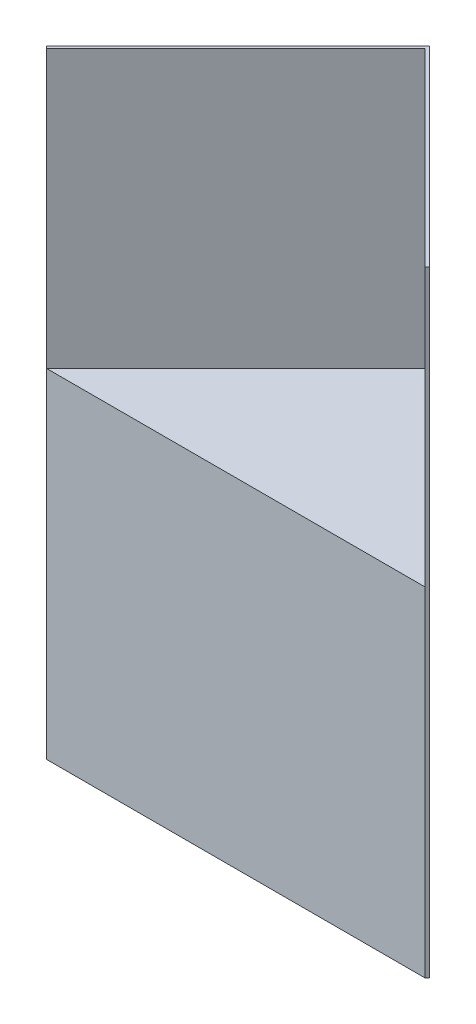
ISO-10303-21;
HEADER;
FILE_DESCRIPTION(('STEP AP214'),'2;1');
FILE_NAME('part.step','',(''),(''),'','','');
FILE_SCHEMA(('AUTOMOTIVE_DESIGN { 1 0 10303 214 1 1 1 1 }'));
ENDSEC;
DATA;
#1=APPLICATION_CONTEXT('core data for automotive mechanical design processes');
#2=APPLICATION_PROTOCOL_DEFINITION('international standard','automotive_design',2000,#1);
#3=PRODUCT_CONTEXT('',#1,'mechanical');
#4=PRODUCT('Part','Part','',(#3));
#5=PRODUCT_RELATED_PRODUCT_CATEGORY('part','',(#4));
#6=PRODUCT_DEFINITION_FORMATION('','',#4);
#7=PRODUCT_DEFINITION_CONTEXT('part definition',#1,'design');
#8=PRODUCT_DEFINITION('design','',#6,#7);
#9=PRODUCT_DEFINITION_SHAPE('','',#8);
#10=(LENGTH_UNIT() NAMED_UNIT(*) SI_UNIT(.MILLI.,.METRE.));
#11=(NAMED_UNIT(*) PLANE_ANGLE_UNIT() SI_UNIT($,.RADIAN.));
#12=(NAMED_UNIT(*) SI_UNIT($,.STERADIAN.) SOLID_ANGLE_UNIT());
#13=UNCERTAINTY_MEASURE_WITH_UNIT(LENGTH_MEASURE(1.E-05),#10,'distance_accuracy_value','');
#14=(GEOMETRIC_REPRESENTATION_CONTEXT(3) GLOBAL_UNCERTAINTY_ASSIGNED_CONTEXT((#13)) GLOBAL_UNIT_ASSIGNED_CONTEXT((#10,
#11,#12)) REPRESENTATION_CONTEXT('',''));
#15=CARTESIAN_POINT('',(0.,0.,0.));
#16=DIRECTION('',(0.,0.,1.));
#17=DIRECTION('',(1.,0.,0.));
#18=AXIS2_PLACEMENT_3D('',#15,#16,#17);
#19=CARTESIAN_POINT('',(-781.05,1397.,781.05));
#20=DIRECTION('',(0.,0.,-1.));
#21=DIRECTION('',(-1.,0.,0.));
#22=AXIS2_PLACEMENT_3D('',#19,#20,#21);
#23=PLANE('',#22);
#24=DIRECTION('',(1.,0.,0.));
#25=VECTOR('',#24,1.);
#26=CARTESIAN_POINT('',(-781.05,0.,781.05));
#27=LINE('',#26,#25);
#28=CARTESIAN_POINT('',(-781.05,0.,781.05));
#29=VERTEX_POINT('',#28);
#30=CARTESIAN_POINT('',(781.05,0.,781.05));
#31=VERTEX_POINT('',#30);
#32=EDGE_CURVE('E120',#29,#31,#27,.T.);
#33=ORIENTED_EDGE('',*,*,#32,.T.);
#34=DIRECTION('',(0.,-1.,0.));
#35=VECTOR('',#34,1.);
#36=CARTESIAN_POINT('',(781.05,1397.,781.05));
#37=LINE('',#36,#35);
#38=CARTESIAN_POINT('',(781.05,1397.,781.05));
#39=VERTEX_POINT('',#38);
#40=EDGE_CURVE('E49',#39,#31,#37,.T.);
#41=ORIENTED_EDGE('',*,*,#40,.F.);
#42=DIRECTION('',(1.,0.,0.));
#43=VECTOR('',#42,1.);
#44=CARTESIAN_POINT('',(-781.05,1397.,781.05));
#45=LINE('',#44,#43);
#46=CARTESIAN_POINT('',(-781.05,1397.,781.05));
#47=VERTEX_POINT('',#46);
#48=EDGE_CURVE('E56',#47,#39,#45,.T.);
#49=ORIENTED_EDGE('',*,*,#48,.F.);
#50=DIRECTION('',(0.,-1.,0.));
#51=VECTOR('',#50,1.);
#52=CARTESIAN_POINT('',(-781.05,1397.,781.05));
#53=LINE('',#52,#51);
#54=EDGE_CURVE('E11',#47,#29,#53,.T.);
#55=ORIENTED_EDGE('',*,*,#54,.T.);
#56=EDGE_LOOP('',(#33,#41,#49,#55));
#57=FACE_BOUND('',#56,.T.);
#58=ADVANCED_FACE('F41',(#57),#23,.F.);
#59=CARTESIAN_POINT('',(0.,1397.,0.));
#60=DIRECTION('',(0.,1.,0.));
#61=DIRECTION('',(0.,0.,1.));
#62=AXIS2_PLACEMENT_3D('',#59,#60,#61);
#63=PLANE('',#62);
#64=DIRECTION('',(-0.707106781186548,0.,-0.707106781186548));
#65=VECTOR('',#64,1.);
#66=CARTESIAN_POINT('',(781.05,1397.,781.05));
#67=LINE('',#66,#65);
#68=CARTESIAN_POINT('',(0.,1397.,0.));
#69=VERTEX_POINT('',#68);
#70=EDGE_CURVE('E119',#39,#69,#67,.T.);
#71=ORIENTED_EDGE('',*,*,#70,.T.);
#72=DIRECTION('',(-0.707106781186548,0.,0.707106781186548));
#73=VECTOR('',#72,1.);
#74=CARTESIAN_POINT('',(0.,1397.,0.));
#75=LINE('',#74,#73);
#76=EDGE_CURVE('E131',#69,#47,#75,.T.);
#77=ORIENTED_EDGE('',*,*,#76,.T.);
#78=ORIENTED_EDGE('',*,*,#48,.T.);
#79=EDGE_LOOP('',(#71,#77,#78));
#80=FACE_BOUND('',#79,.T.);
#81=ADVANCED_FACE('F188',(#80),#63,.T.);
#82=CARTESIAN_POINT('',(0.,0.,0.));
#83=DIRECTION('',(0.,1.,0.));
#84=DIRECTION('',(0.,0.,1.));
#85=AXIS2_PLACEMENT_3D('',#82,#83,#84);
#86=PLANE('',#85);
#87=DIRECTION('',(0.707106781186547,0.,-0.707106781186547));
#88=VECTOR('',#87,1.);
#89=CARTESIAN_POINT('',(781.05,0.,781.05));
#90=LINE('',#89,#88);
#91=CARTESIAN_POINT('',(790.030256121069,0.,772.069743878931));
#92=VERTEX_POINT('',#91);
#93=EDGE_CURVE('E136',#31,#92,#90,.T.);
#94=ORIENTED_EDGE('',*,*,#93,.F.);
#95=ORIENTED_EDGE('',*,*,#32,.F.);
#96=DIRECTION('',(0.707106781186547,0.,0.707106781186547));
#97=VECTOR('',#96,1.);
#98=CARTESIAN_POINT('',(-781.05,0.,781.05));
#99=LINE('',#98,#97);
#100=CARTESIAN_POINT('',(-790.030256121069,0.,772.069743878931));
#101=VERTEX_POINT('',#100);
#102=EDGE_CURVE('E115',#101,#29,#99,.T.);
#103=ORIENTED_EDGE('',*,*,#102,.F.);
#104=DIRECTION('',(-0.707106781186548,0.,0.707106781186548));
#105=VECTOR('',#104,1.);
#106=CARTESIAN_POINT('',(0.,0.,-17.9605122421383));
#107=LINE('',#106,#105);
#108=CARTESIAN_POINT('',(0.,0.,-17.9605122421383));
#109=VERTEX_POINT('',#108);
#110=EDGE_CURVE('E145',#109,#101,#107,.T.);
#111=ORIENTED_EDGE('',*,*,#110,.F.);
#112=DIRECTION('',(-0.707106781186548,0.,-0.707106781186548));
#113=VECTOR('',#112,1.);
#114=CARTESIAN_POINT('',(790.030256121069,0.,772.069743878931));
#115=LINE('',#114,#113);
#116=EDGE_CURVE('E143',#92,#109,#115,.T.);
#117=ORIENTED_EDGE('',*,*,#116,.F.);
#118=EDGE_LOOP('',(#94,#95,#103,#111,#117));
#119=FACE_BOUND('',#118,.T.);
#120=ADVANCED_FACE('F140',(#119),#86,.F.);
#121=CARTESIAN_POINT('',(781.05,2540.,781.05));
#122=DIRECTION('',(0.707106781186547,0.,-0.707106781186547));
#123=DIRECTION('',(-0.707106781186548,0.,-0.707106781186548));
#124=AXIS2_PLACEMENT_3D('',#121,#122,#123);
#125=PLANE('',#124);
#126=ORIENTED_EDGE('',*,*,#70,.F.);
#127=DIRECTION('',(0.,-1.,0.));
#128=VECTOR('',#127,1.);
#129=CARTESIAN_POINT('',(781.05,2540.,781.05));
#130=LINE('',#129,#128);
#131=CARTESIAN_POINT('',(781.05,2540.,781.05));
#132=VERTEX_POINT('',#131);
#133=EDGE_CURVE('E100',#132,#39,#130,.T.);
#134=ORIENTED_EDGE('',*,*,#133,.F.);
#135=DIRECTION('',(0.707106781186548,0.,0.707106781186548));
#136=VECTOR('',#135,1.);
#137=CARTESIAN_POINT('',(781.05,2540.,781.05));
#138=LINE('',#137,#136);
#139=CARTESIAN_POINT('',(0.,2540.,0.));
#140=VERTEX_POINT('',#139);
#141=EDGE_CURVE('E106',#140,#132,#138,.T.);
#142=ORIENTED_EDGE('',*,*,#141,.F.);
#143=DIRECTION('',(0.,-1.,0.));
#144=VECTOR('',#143,1.);
#145=CARTESIAN_POINT('',(0.,2540.,0.));
#146=LINE('',#145,#144);
#147=EDGE_CURVE('E153',#140,#69,#146,.T.);
#148=ORIENTED_EDGE('',*,*,#147,.T.);
#149=EDGE_LOOP('',(#126,#134,#142,#148));
#150=FACE_BOUND('',#149,.T.);
#151=ADVANCED_FACE('F118',(#150),#125,.F.);
#152=CARTESIAN_POINT('',(781.05,2540.,781.05));
#153=DIRECTION('',(-0.707106781186547,0.,-0.707106781186547));
#154=DIRECTION('',(-0.707106781186548,0.,0.707106781186548));
#155=AXIS2_PLACEMENT_3D('',#152,#153,#154);
#156=PLANE('',#155);
#157=ORIENTED_EDGE('',*,*,#93,.T.);
#158=DIRECTION('',(0.,-1.,0.));
#159=VECTOR('',#158,1.);
#160=CARTESIAN_POINT('',(790.030256121069,2540.,772.069743878931));
#161=LINE('',#160,#159);
#162=CARTESIAN_POINT('',(790.030256121069,2540.,772.069743878931));
#163=VERTEX_POINT('',#162);
#164=EDGE_CURVE('E102',#163,#92,#161,.T.);
#165=ORIENTED_EDGE('',*,*,#164,.F.);
#166=DIRECTION('',(0.707106781186547,0.,-0.707106781186547));
#167=VECTOR('',#166,1.);
#168=CARTESIAN_POINT('',(781.05,2540.,781.05));
#169=LINE('',#168,#167);
#170=EDGE_CURVE('E95',#132,#163,#169,.T.);
#171=ORIENTED_EDGE('',*,*,#170,.F.);
#172=ORIENTED_EDGE('',*,*,#133,.T.);
#173=ORIENTED_EDGE('',*,*,#40,.T.);
#174=EDGE_LOOP('',(#157,#165,#171,#172,#173));
#175=FACE_BOUND('',#174,.T.);
#176=ADVANCED_FACE('F97',(#175),#156,.F.);
#177=CARTESIAN_POINT('',(790.030256121069,2540.,772.069743878931));
#178=DIRECTION('',(-0.707106781186548,0.,0.707106781186547));
#179=DIRECTION('',(0.707106781186547,0.,0.707106781186548));
#180=AXIS2_PLACEMENT_3D('',#177,#178,#179);
#181=PLANE('',#180);
#182=ORIENTED_EDGE('',*,*,#116,.T.);
#183=DIRECTION('',(0.,-1.,0.));
#184=VECTOR('',#183,1.);
#185=CARTESIAN_POINT('',(0.,2540.,-17.9605122421383));
#186=LINE('',#185,#184);
#187=CARTESIAN_POINT('',(0.,2540.,-17.9605122421383));
#188=VERTEX_POINT('',#187);
#189=EDGE_CURVE('E125',#188,#109,#186,.T.);
#190=ORIENTED_EDGE('',*,*,#189,.F.);
#191=DIRECTION('',(-0.707106781186548,0.,-0.707106781186548));
#192=VECTOR('',#191,1.);
#193=CARTESIAN_POINT('',(790.030256121069,2540.,772.069743878931));
#194=LINE('',#193,#192);
#195=EDGE_CURVE('E105',#163,#188,#194,.T.);
#196=ORIENTED_EDGE('',*,*,#195,.F.);
#197=ORIENTED_EDGE('',*,*,#164,.T.);
#198=EDGE_LOOP('',(#182,#190,#196,#197));
#199=FACE_BOUND('',#198,.T.);
#200=ADVANCED_FACE('F178',(#199),#181,.F.);
#201=CARTESIAN_POINT('',(0.,2540.,-17.9605122421383));
#202=DIRECTION('',(0.707106781186548,0.,0.707106781186547));
#203=DIRECTION('',(0.707106781186547,0.,-0.707106781186548));
#204=AXIS2_PLACEMENT_3D('',#201,#202,#203);
#205=PLANE('',#204);
#206=ORIENTED_EDGE('',*,*,#110,.T.);
#207=DIRECTION('',(0.,-1.,0.));
#208=VECTOR('',#207,1.);
#209=CARTESIAN_POINT('',(-790.030256121069,2540.,772.069743878931));
#210=LINE('',#209,#208);
#211=CARTESIAN_POINT('',(-790.030256121069,2540.,772.069743878931));
#212=VERTEX_POINT('',#211);
#213=EDGE_CURVE('E159',#212,#101,#210,.T.);
#214=ORIENTED_EDGE('',*,*,#213,.F.);
#215=DIRECTION('',(-0.707106781186548,0.,0.707106781186548));
#216=VECTOR('',#215,1.);
#217=CARTESIAN_POINT('',(0.,2540.,-17.9605122421383));
#218=LINE('',#217,#216);
#219=EDGE_CURVE('E168',#188,#212,#218,.T.);
#220=ORIENTED_EDGE('',*,*,#219,.F.);
#221=ORIENTED_EDGE('',*,*,#189,.T.);
#222=EDGE_LOOP('',(#206,#214,#220,#221));
#223=FACE_BOUND('',#222,.T.);
#224=ADVANCED_FACE('F166',(#223),#205,.F.);
#225=CARTESIAN_POINT('',(-781.05,2540.,781.05));
#226=DIRECTION('',(0.707106781186547,0.,-0.707106781186547));
#227=DIRECTION('',(-0.707106781186548,0.,-0.707106781186548));
#228=AXIS2_PLACEMENT_3D('',#225,#226,#227);
#229=PLANE('',#228);
#230=ORIENTED_EDGE('',*,*,#102,.T.);
#231=ORIENTED_EDGE('',*,*,#54,.F.);
#232=DIRECTION('',(0.,-1.,0.));
#233=VECTOR('',#232,1.);
#234=CARTESIAN_POINT('',(-781.05,2540.,781.05));
#235=LINE('',#234,#233);
#236=CARTESIAN_POINT('',(-781.05,2540.,781.05));
#237=VERTEX_POINT('',#236);
#238=EDGE_CURVE('E156',#237,#47,#235,.T.);
#239=ORIENTED_EDGE('',*,*,#238,.F.);
#240=DIRECTION('',(0.707106781186547,0.,0.707106781186547));
#241=VECTOR('',#240,1.);
#242=CARTESIAN_POINT('',(-781.05,2540.,781.05));
#243=LINE('',#242,#241);
#244=EDGE_CURVE('E175',#212,#237,#243,.T.);
#245=ORIENTED_EDGE('',*,*,#244,.F.);
#246=ORIENTED_EDGE('',*,*,#213,.T.);
#247=EDGE_LOOP('',(#230,#231,#239,#245,#246));
#248=FACE_BOUND('',#247,.T.);
#249=ADVANCED_FACE('F172',(#248),#229,.F.);
#250=CARTESIAN_POINT('',(0.,2540.,0.));
#251=DIRECTION('',(-0.707106781186547,0.,-0.707106781186547));
#252=DIRECTION('',(-0.707106781186548,0.,0.707106781186548));
#253=AXIS2_PLACEMENT_3D('',#250,#251,#252);
#254=PLANE('',#253);
#255=ORIENTED_EDGE('',*,*,#76,.F.);
#256=ORIENTED_EDGE('',*,*,#147,.F.);
#257=DIRECTION('',(0.707106781186548,0.,-0.707106781186548));
#258=VECTOR('',#257,1.);
#259=CARTESIAN_POINT('',(0.,2540.,0.));
#260=LINE('',#259,#258);
#261=EDGE_CURVE('E111',#237,#140,#260,.T.);
#262=ORIENTED_EDGE('',*,*,#261,.F.);
#263=ORIENTED_EDGE('',*,*,#238,.T.);
#264=EDGE_LOOP('',(#255,#256,#262,#263));
#265=FACE_BOUND('',#264,.T.);
#266=ADVANCED_FACE('F228',(#265),#254,.F.);
#267=CARTESIAN_POINT('',(0.,2540.,0.));
#268=DIRECTION('',(0.,1.,0.));
#269=DIRECTION('',(0.,0.,1.));
#270=AXIS2_PLACEMENT_3D('',#267,#268,#269);
#271=PLANE('',#270);
#272=ORIENTED_EDGE('',*,*,#141,.T.);
#273=ORIENTED_EDGE('',*,*,#170,.T.);
#274=ORIENTED_EDGE('',*,*,#195,.T.);
#275=ORIENTED_EDGE('',*,*,#219,.T.);
#276=ORIENTED_EDGE('',*,*,#244,.T.);
#277=ORIENTED_EDGE('',*,*,#261,.T.);
#278=EDGE_LOOP('',(#272,#273,#274,#275,#276,#277));
#279=FACE_BOUND('',#278,.T.);
#280=ADVANCED_FACE('F109',(#279),#271,.T.);
#281=CLOSED_SHELL('',(#58,#81,#120,#151,#176,#200,#224,#249,#266,#280));
#282=MANIFOLD_SOLID_BREP('B2',#281);
#283=ADVANCED_BREP_SHAPE_REPRESENTATION('',(#18,#282),#14);
#284=SHAPE_DEFINITION_REPRESENTATION(#9,#283);
ENDSEC;
END-ISO-10303-21;
